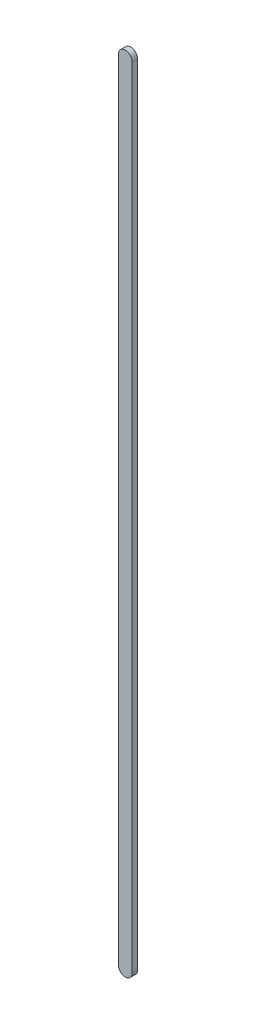
ISO-10303-21;
HEADER;
FILE_DESCRIPTION(('STEP AP214'),'2;1');
FILE_NAME('part.step','',(''),(''),'','','');
FILE_SCHEMA(('AUTOMOTIVE_DESIGN { 1 0 10303 214 1 1 1 1 }'));
ENDSEC;
DATA;
#1=APPLICATION_CONTEXT('core data for automotive mechanical design processes');
#2=APPLICATION_PROTOCOL_DEFINITION('international standard','automotive_design',2000,#1);
#3=PRODUCT_CONTEXT('',#1,'mechanical');
#4=PRODUCT('Part','Part','',(#3));
#5=PRODUCT_RELATED_PRODUCT_CATEGORY('part','',(#4));
#6=PRODUCT_DEFINITION_FORMATION('','',#4);
#7=PRODUCT_DEFINITION_CONTEXT('part definition',#1,'design');
#8=PRODUCT_DEFINITION('design','',#6,#7);
#9=PRODUCT_DEFINITION_SHAPE('','',#8);
#10=(LENGTH_UNIT() NAMED_UNIT(*) SI_UNIT(.MILLI.,.METRE.));
#11=(NAMED_UNIT(*) PLANE_ANGLE_UNIT() SI_UNIT($,.RADIAN.));
#12=(NAMED_UNIT(*) SI_UNIT($,.STERADIAN.) SOLID_ANGLE_UNIT());
#13=UNCERTAINTY_MEASURE_WITH_UNIT(LENGTH_MEASURE(1.E-05),#10,'distance_accuracy_value','');
#14=(GEOMETRIC_REPRESENTATION_CONTEXT(3) GLOBAL_UNCERTAINTY_ASSIGNED_CONTEXT((#13)) GLOBAL_UNIT_ASSIGNED_CONTEXT((#10,
#11,#12)) REPRESENTATION_CONTEXT('',''));
#15=CARTESIAN_POINT('',(0.,0.,0.));
#16=DIRECTION('',(0.,0.,1.));
#17=DIRECTION('',(1.,0.,0.));
#18=AXIS2_PLACEMENT_3D('',#15,#16,#17);
#19=CARTESIAN_POINT('',(86.741,61.3775252,0.));
#20=DIRECTION('',(-1.,0.,0.));
#21=DIRECTION('',(0.,1.,0.));
#22=AXIS2_PLACEMENT_3D('',#19,#20,#21);
#23=PLANE('',#22);
#24=DIRECTION('',(0.,1.,0.));
#25=VECTOR('',#24,1.);
#26=CARTESIAN_POINT('',(86.741,61.3775252,0.1999996));
#27=LINE('',#26,#25);
#28=CARTESIAN_POINT('',(86.741,61.3775252,0.1999996));
#29=VERTEX_POINT('',#28);
#30=CARTESIAN_POINT('',(86.741,90.551,0.1999996));
#31=VERTEX_POINT('',#30);
#32=EDGE_CURVE('E11',#29,#31,#27,.T.);
#33=ORIENTED_EDGE('',*,*,#32,.F.);
#34=DIRECTION('',(0.,0.,1.));
#35=VECTOR('',#34,1.);
#36=CARTESIAN_POINT('',(86.741,61.3775252,0.));
#37=LINE('',#36,#35);
#38=CARTESIAN_POINT('',(86.741,61.3775252,0.));
#39=VERTEX_POINT('',#38);
#40=EDGE_CURVE('E24',#39,#29,#37,.T.);
#41=ORIENTED_EDGE('',*,*,#40,.F.);
#42=DIRECTION('',(0.,1.,0.));
#43=VECTOR('',#42,1.);
#44=CARTESIAN_POINT('',(86.741,61.3775252,0.));
#45=LINE('',#44,#43);
#46=CARTESIAN_POINT('',(86.741,90.551,0.));
#47=VERTEX_POINT('',#46);
#48=EDGE_CURVE('E75',#39,#47,#45,.T.);
#49=ORIENTED_EDGE('',*,*,#48,.T.);
#50=DIRECTION('',(0.,0.,1.));
#51=VECTOR('',#50,1.);
#52=CARTESIAN_POINT('',(86.741,90.551,0.));
#53=LINE('',#52,#51);
#54=EDGE_CURVE('E37',#47,#31,#53,.T.);
#55=ORIENTED_EDGE('',*,*,#54,.T.);
#56=EDGE_LOOP('',(#33,#41,#49,#55));
#57=FACE_BOUND('',#56,.T.);
#58=ADVANCED_FACE('F17',(#57),#23,.F.);
#59=CARTESIAN_POINT('',(86.487,90.551,0.));
#60=DIRECTION('',(0.,0.,-1.));
#61=DIRECTION('',(1.,0.,0.));
#62=AXIS2_PLACEMENT_3D('',#59,#60,#61);
#63=CYLINDRICAL_SURFACE('',#62,0.254);
#64=CARTESIAN_POINT('',(86.487,90.551,0.1999996));
#65=DIRECTION('',(0.,0.,1.));
#66=DIRECTION('',(1.,0.,0.));
#67=AXIS2_PLACEMENT_3D('',#64,#65,#66);
#68=CIRCLE('',#67,0.254);
#69=CARTESIAN_POINT('',(86.233,90.551,0.1999996));
#70=VERTEX_POINT('',#69);
#71=EDGE_CURVE('E83',#31,#70,#68,.T.);
#72=ORIENTED_EDGE('',*,*,#71,.F.);
#73=ORIENTED_EDGE('',*,*,#54,.F.);
#74=CARTESIAN_POINT('',(86.487,90.551,0.));
#75=DIRECTION('',(0.,0.,1.));
#76=DIRECTION('',(1.,0.,0.));
#77=AXIS2_PLACEMENT_3D('',#74,#75,#76);
#78=CIRCLE('',#77,0.254);
#79=CARTESIAN_POINT('',(86.233,90.551,0.));
#80=VERTEX_POINT('',#79);
#81=EDGE_CURVE('E81',#47,#80,#78,.T.);
#82=ORIENTED_EDGE('',*,*,#81,.T.);
#83=DIRECTION('',(0.,0.,1.));
#84=VECTOR('',#83,1.);
#85=CARTESIAN_POINT('',(86.233,90.551,0.));
#86=LINE('',#85,#84);
#87=EDGE_CURVE('E67',#80,#70,#86,.T.);
#88=ORIENTED_EDGE('',*,*,#87,.T.);
#89=EDGE_LOOP('',(#72,#73,#82,#88));
#90=FACE_BOUND('',#89,.T.);
#91=ADVANCED_FACE('F89',(#90),#63,.T.);
#92=CARTESIAN_POINT('',(86.233,90.551,0.));
#93=DIRECTION('',(1.,0.,0.));
#94=DIRECTION('',(0.,-1.,0.));
#95=AXIS2_PLACEMENT_3D('',#92,#93,#94);
#96=PLANE('',#95);
#97=DIRECTION('',(0.,-1.,0.));
#98=VECTOR('',#97,1.);
#99=CARTESIAN_POINT('',(86.233,90.551,0.1999996));
#100=LINE('',#99,#98);
#101=CARTESIAN_POINT('',(86.233,61.3775252,0.1999996));
#102=VERTEX_POINT('',#101);
#103=EDGE_CURVE('E71',#70,#102,#100,.T.);
#104=ORIENTED_EDGE('',*,*,#103,.F.);
#105=ORIENTED_EDGE('',*,*,#87,.F.);
#106=DIRECTION('',(0.,-1.,0.));
#107=VECTOR('',#106,1.);
#108=CARTESIAN_POINT('',(86.233,90.551,0.));
#109=LINE('',#108,#107);
#110=CARTESIAN_POINT('',(86.233,61.3775252,0.));
#111=VERTEX_POINT('',#110);
#112=EDGE_CURVE('E63',#80,#111,#109,.T.);
#113=ORIENTED_EDGE('',*,*,#112,.T.);
#114=DIRECTION('',(0.,0.,1.));
#115=VECTOR('',#114,1.);
#116=CARTESIAN_POINT('',(86.233,61.3775252,0.));
#117=LINE('',#116,#115);
#118=EDGE_CURVE('E53',#111,#102,#117,.T.);
#119=ORIENTED_EDGE('',*,*,#118,.T.);
#120=EDGE_LOOP('',(#104,#105,#113,#119));
#121=FACE_BOUND('',#120,.T.);
#122=ADVANCED_FACE('F66',(#121),#96,.F.);
#123=CARTESIAN_POINT('',(86.487,61.3775252,0.));
#124=DIRECTION('',(0.,0.,-1.));
#125=DIRECTION('',(-1.,0.,0.));
#126=AXIS2_PLACEMENT_3D('',#123,#124,#125);
#127=CYLINDRICAL_SURFACE('',#126,0.253999999999998);
#128=CARTESIAN_POINT('',(86.487,61.3775252,0.1999996));
#129=DIRECTION('',(0.,0.,1.));
#130=DIRECTION('',(-1.,0.,0.));
#131=AXIS2_PLACEMENT_3D('',#128,#129,#130);
#132=CIRCLE('',#131,0.253999999999998);
#133=EDGE_CURVE('E59',#102,#29,#132,.T.);
#134=ORIENTED_EDGE('',*,*,#133,.F.);
#135=ORIENTED_EDGE('',*,*,#118,.F.);
#136=CARTESIAN_POINT('',(86.487,61.3775252,0.));
#137=DIRECTION('',(0.,0.,1.));
#138=DIRECTION('',(-1.,0.,0.));
#139=AXIS2_PLACEMENT_3D('',#136,#137,#138);
#140=CIRCLE('',#139,0.253999999999998);
#141=EDGE_CURVE('E57',#111,#39,#140,.T.);
#142=ORIENTED_EDGE('',*,*,#141,.T.);
#143=ORIENTED_EDGE('',*,*,#40,.T.);
#144=EDGE_LOOP('',(#134,#135,#142,#143));
#145=FACE_BOUND('',#144,.T.);
#146=ADVANCED_FACE('F55',(#145),#127,.T.);
#147=CARTESIAN_POINT('',(86.741,61.3775252,0.));
#148=DIRECTION('',(0.,0.,-1.));
#149=DIRECTION('',(-1.,0.,0.));
#150=AXIS2_PLACEMENT_3D('',#147,#148,#149);
#151=PLANE('',#150);
#152=ORIENTED_EDGE('',*,*,#141,.F.);
#153=ORIENTED_EDGE('',*,*,#112,.F.);
#154=ORIENTED_EDGE('',*,*,#81,.F.);
#155=ORIENTED_EDGE('',*,*,#48,.F.);
#156=EDGE_LOOP('',(#152,#153,#154,#155));
#157=FACE_BOUND('',#156,.T.);
#158=ADVANCED_FACE('F74',(#157),#151,.T.);
#159=CARTESIAN_POINT('',(86.741,61.3775252,0.1999996));
#160=DIRECTION('',(0.,0.,-1.));
#161=DIRECTION('',(-1.,0.,0.));
#162=AXIS2_PLACEMENT_3D('',#159,#160,#161);
#163=PLANE('',#162);
#164=ORIENTED_EDGE('',*,*,#32,.T.);
#165=ORIENTED_EDGE('',*,*,#71,.T.);
#166=ORIENTED_EDGE('',*,*,#103,.T.);
#167=ORIENTED_EDGE('',*,*,#133,.T.);
#168=EDGE_LOOP('',(#164,#165,#166,#167));
#169=FACE_BOUND('',#168,.T.);
#170=ADVANCED_FACE('F91',(#169),#163,.F.);
#171=CLOSED_SHELL('',(#58,#91,#122,#146,#158,#170));
#172=MANIFOLD_SOLID_BREP('B1',#171);
#173=ADVANCED_BREP_SHAPE_REPRESENTATION('',(#18,#172),#14);
#174=SHAPE_DEFINITION_REPRESENTATION(#9,#173);
ENDSEC;
END-ISO-10303-21;
